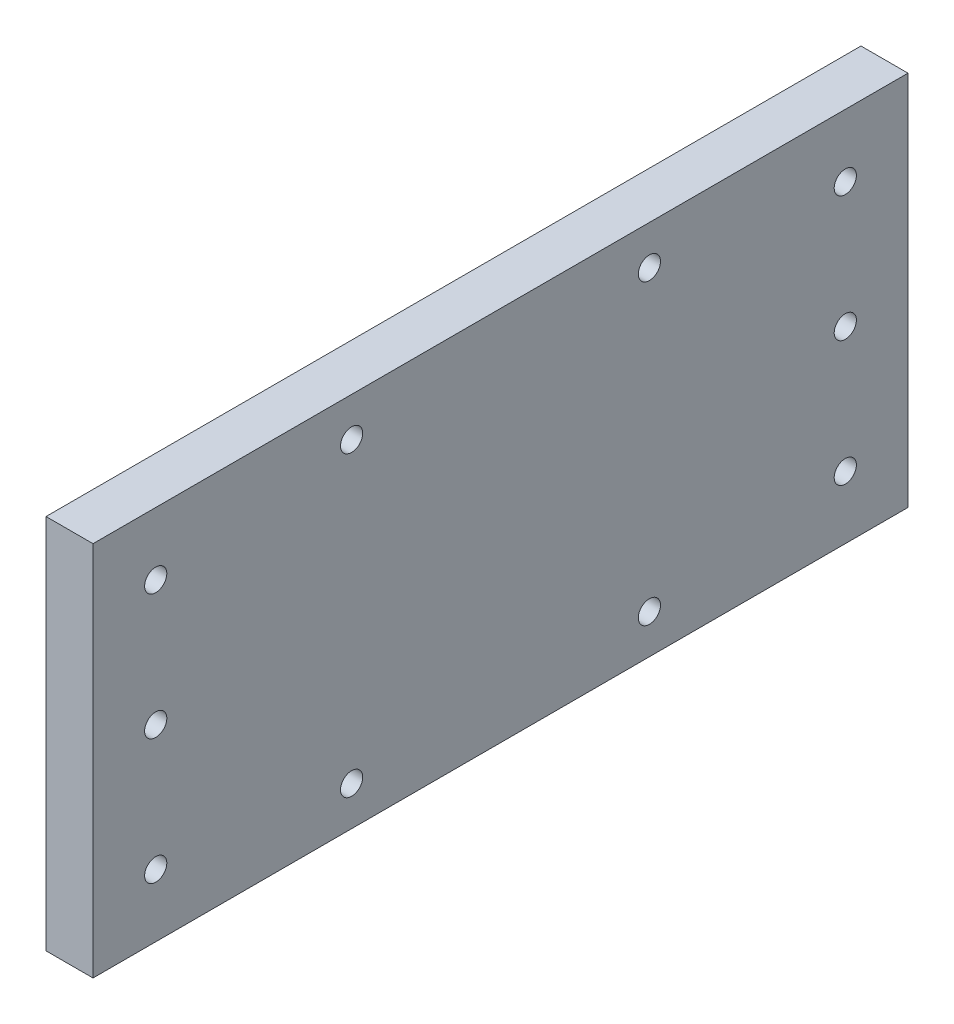
ISO-10303-21;
HEADER;
FILE_DESCRIPTION(('STEP AP214'),'2;1');
FILE_NAME('part.step','',(''),(''),'','','');
FILE_SCHEMA(('AUTOMOTIVE_DESIGN { 1 0 10303 214 1 1 1 1 }'));
ENDSEC;
DATA;
#1=APPLICATION_CONTEXT('core data for automotive mechanical design processes');
#2=APPLICATION_PROTOCOL_DEFINITION('international standard','automotive_design',2000,#1);
#3=PRODUCT_CONTEXT('',#1,'mechanical');
#4=PRODUCT('Part','Part','',(#3));
#5=PRODUCT_RELATED_PRODUCT_CATEGORY('part','',(#4));
#6=PRODUCT_DEFINITION_FORMATION('','',#4);
#7=PRODUCT_DEFINITION_CONTEXT('part definition',#1,'design');
#8=PRODUCT_DEFINITION('design','',#6,#7);
#9=PRODUCT_DEFINITION_SHAPE('','',#8);
#10=(LENGTH_UNIT() NAMED_UNIT(*) SI_UNIT(.MILLI.,.METRE.));
#11=(NAMED_UNIT(*) PLANE_ANGLE_UNIT() SI_UNIT($,.RADIAN.));
#12=(NAMED_UNIT(*) SI_UNIT($,.STERADIAN.) SOLID_ANGLE_UNIT());
#13=UNCERTAINTY_MEASURE_WITH_UNIT(LENGTH_MEASURE(1.E-05),#10,'distance_accuracy_value','');
#14=(GEOMETRIC_REPRESENTATION_CONTEXT(3) GLOBAL_UNCERTAINTY_ASSIGNED_CONTEXT((#13)) GLOBAL_UNIT_ASSIGNED_CONTEXT((#10,
#11,#12)) REPRESENTATION_CONTEXT('',''));
#15=CARTESIAN_POINT('',(0.,0.,0.));
#16=DIRECTION('',(0.,0.,1.));
#17=DIRECTION('',(1.,0.,0.));
#18=AXIS2_PLACEMENT_3D('',#15,#16,#17);
#19=CARTESIAN_POINT('',(4.76249999999999,38.1,165.1));
#20=DIRECTION('',(-1.,0.,0.));
#21=DIRECTION('',(0.,-1.,0.));
#22=AXIS2_PLACEMENT_3D('',#19,#20,#21);
#23=PLANE('',#22);
#24=CARTESIAN_POINT('',(4.7625,25.4,152.4));
#25=DIRECTION('',(1.,0.,0.));
#26=DIRECTION('',(0.,0.,-1.));
#27=AXIS2_PLACEMENT_3D('',#24,#25,#26);
#28=CIRCLE('',#27,2.24789999999999);
#29=CARTESIAN_POINT('',(4.7625,25.4,150.1521));
#30=VERTEX_POINT('',#29);
#31=EDGE_CURVE('E165',#30,#30,#28,.T.);
#32=ORIENTED_EDGE('',*,*,#31,.F.);
#33=EDGE_LOOP('',(#32));
#34=FACE_BOUND('',#33,.T.);
#35=CARTESIAN_POINT('',(4.7625,0.,152.4));
#36=DIRECTION('',(1.,0.,0.));
#37=DIRECTION('',(0.,0.,-1.));
#38=AXIS2_PLACEMENT_3D('',#35,#36,#37);
#39=CIRCLE('',#38,2.24789999999999);
#40=CARTESIAN_POINT('',(4.7625,0.,150.1521));
#41=VERTEX_POINT('',#40);
#42=EDGE_CURVE('E159',#41,#41,#39,.T.);
#43=ORIENTED_EDGE('',*,*,#42,.F.);
#44=EDGE_LOOP('',(#43));
#45=FACE_BOUND('',#44,.T.);
#46=CARTESIAN_POINT('',(4.7625,-25.4,152.4));
#47=DIRECTION('',(1.,0.,0.));
#48=DIRECTION('',(0.,0.,-1.));
#49=AXIS2_PLACEMENT_3D('',#46,#47,#48);
#50=CIRCLE('',#49,2.24789999999999);
#51=CARTESIAN_POINT('',(4.7625,-25.4,150.1521));
#52=VERTEX_POINT('',#51);
#53=EDGE_CURVE('E153',#52,#52,#50,.T.);
#54=ORIENTED_EDGE('',*,*,#53,.F.);
#55=EDGE_LOOP('',(#54));
#56=FACE_BOUND('',#55,.T.);
#57=CARTESIAN_POINT('',(4.7625,25.4,12.7));
#58=DIRECTION('',(1.,0.,0.));
#59=DIRECTION('',(0.,0.,-1.));
#60=AXIS2_PLACEMENT_3D('',#57,#58,#59);
#61=CIRCLE('',#60,2.24789999999999);
#62=CARTESIAN_POINT('',(4.7625,25.4,10.4521));
#63=VERTEX_POINT('',#62);
#64=EDGE_CURVE('E147',#63,#63,#61,.T.);
#65=ORIENTED_EDGE('',*,*,#64,.F.);
#66=EDGE_LOOP('',(#65));
#67=FACE_BOUND('',#66,.T.);
#68=CARTESIAN_POINT('',(4.7625,0.,12.7));
#69=DIRECTION('',(1.,0.,0.));
#70=DIRECTION('',(0.,0.,-1.));
#71=AXIS2_PLACEMENT_3D('',#68,#69,#70);
#72=CIRCLE('',#71,2.24789999999999);
#73=CARTESIAN_POINT('',(4.7625,0.,10.4521));
#74=VERTEX_POINT('',#73);
#75=EDGE_CURVE('E141',#74,#74,#72,.T.);
#76=ORIENTED_EDGE('',*,*,#75,.F.);
#77=EDGE_LOOP('',(#76));
#78=FACE_BOUND('',#77,.T.);
#79=CARTESIAN_POINT('',(4.7625,-25.4,12.7));
#80=DIRECTION('',(1.,0.,0.));
#81=DIRECTION('',(0.,0.,-1.));
#82=AXIS2_PLACEMENT_3D('',#79,#80,#81);
#83=CIRCLE('',#82,2.24789999999999);
#84=CARTESIAN_POINT('',(4.7625,-25.4,10.4521));
#85=VERTEX_POINT('',#84);
#86=EDGE_CURVE('E135',#85,#85,#83,.T.);
#87=ORIENTED_EDGE('',*,*,#86,.F.);
#88=EDGE_LOOP('',(#87));
#89=FACE_BOUND('',#88,.T.);
#90=CARTESIAN_POINT('',(4.7625,-30.1625,52.3875));
#91=DIRECTION('',(1.,0.,0.));
#92=DIRECTION('',(0.,0.,-1.));
#93=AXIS2_PLACEMENT_3D('',#90,#91,#92);
#94=CIRCLE('',#93,2.24789999999999);
#95=CARTESIAN_POINT('',(4.7625,-30.1625,50.1396));
#96=VERTEX_POINT('',#95);
#97=EDGE_CURVE('E129',#96,#96,#94,.T.);
#98=ORIENTED_EDGE('',*,*,#97,.F.);
#99=EDGE_LOOP('',(#98));
#100=FACE_BOUND('',#99,.T.);
#101=CARTESIAN_POINT('',(4.7625,30.1625,112.7125));
#102=DIRECTION('',(1.,0.,0.));
#103=DIRECTION('',(0.,0.,-1.));
#104=AXIS2_PLACEMENT_3D('',#101,#102,#103);
#105=CIRCLE('',#104,2.24789999999999);
#106=CARTESIAN_POINT('',(4.7625,30.1625,110.4646));
#107=VERTEX_POINT('',#106);
#108=EDGE_CURVE('E123',#107,#107,#105,.T.);
#109=ORIENTED_EDGE('',*,*,#108,.F.);
#110=EDGE_LOOP('',(#109));
#111=FACE_BOUND('',#110,.T.);
#112=CARTESIAN_POINT('',(4.7625,-30.1625,112.7125));
#113=DIRECTION('',(1.,0.,0.));
#114=DIRECTION('',(0.,0.,-1.));
#115=AXIS2_PLACEMENT_3D('',#112,#113,#114);
#116=CIRCLE('',#115,2.24789999999999);
#117=CARTESIAN_POINT('',(4.7625,-30.1625,110.4646));
#118=VERTEX_POINT('',#117);
#119=EDGE_CURVE('E117',#118,#118,#116,.T.);
#120=ORIENTED_EDGE('',*,*,#119,.F.);
#121=EDGE_LOOP('',(#120));
#122=FACE_BOUND('',#121,.T.);
#123=CARTESIAN_POINT('',(4.7625,30.1625,52.3875));
#124=DIRECTION('',(1.,0.,0.));
#125=DIRECTION('',(0.,0.,-1.));
#126=AXIS2_PLACEMENT_3D('',#123,#124,#125);
#127=CIRCLE('',#126,2.24789999999999);
#128=CARTESIAN_POINT('',(4.7625,30.1625,50.1396));
#129=VERTEX_POINT('',#128);
#130=EDGE_CURVE('E111',#129,#129,#127,.T.);
#131=ORIENTED_EDGE('',*,*,#130,.F.);
#132=EDGE_LOOP('',(#131));
#133=FACE_BOUND('',#132,.T.);
#134=DIRECTION('',(0.,1.,0.));
#135=VECTOR('',#134,1.);
#136=CARTESIAN_POINT('',(4.76249999999999,38.1,0.));
#137=LINE('',#136,#135);
#138=CARTESIAN_POINT('',(4.7625,-38.1,0.));
#139=VERTEX_POINT('',#138);
#140=CARTESIAN_POINT('',(4.76249999999999,38.1,0.));
#141=VERTEX_POINT('',#140);
#142=EDGE_CURVE('E95',#139,#141,#137,.T.);
#143=ORIENTED_EDGE('',*,*,#142,.T.);
#144=DIRECTION('',(0.,0.,-1.));
#145=VECTOR('',#144,1.);
#146=CARTESIAN_POINT('',(4.76249999999999,38.1,165.1));
#147=LINE('',#146,#145);
#148=CARTESIAN_POINT('',(4.76249999999999,38.1,165.1));
#149=VERTEX_POINT('',#148);
#150=EDGE_CURVE('E11',#149,#141,#147,.T.);
#151=ORIENTED_EDGE('',*,*,#150,.F.);
#152=DIRECTION('',(0.,1.,0.));
#153=VECTOR('',#152,1.);
#154=CARTESIAN_POINT('',(4.76249999999999,38.1,165.1));
#155=LINE('',#154,#153);
#156=CARTESIAN_POINT('',(4.7625,-38.1,165.1));
#157=VERTEX_POINT('',#156);
#158=EDGE_CURVE('E83',#157,#149,#155,.T.);
#159=ORIENTED_EDGE('',*,*,#158,.F.);
#160=DIRECTION('',(0.,0.,-1.));
#161=VECTOR('',#160,1.);
#162=CARTESIAN_POINT('',(4.7625,-38.1,165.1));
#163=LINE('',#162,#161);
#164=EDGE_CURVE('E91',#157,#139,#163,.T.);
#165=ORIENTED_EDGE('',*,*,#164,.T.);
#166=EDGE_LOOP('',(#143,#151,#159,#165));
#167=FACE_BOUND('',#166,.T.);
#168=ADVANCED_FACE('F32',(#34,#45,#56,#67,#78,#89,#100,#111,#122,#133,#167),#23,.F.);
#169=CARTESIAN_POINT('',(-4.76250000000001,38.1,165.1));
#170=DIRECTION('',(0.,-1.,0.));
#171=DIRECTION('',(0.,0.,-1.));
#172=AXIS2_PLACEMENT_3D('',#169,#170,#171);
#173=PLANE('',#172);
#174=DIRECTION('',(-1.,0.,0.));
#175=VECTOR('',#174,1.);
#176=CARTESIAN_POINT('',(-4.76250000000001,38.1,0.));
#177=LINE('',#176,#175);
#178=CARTESIAN_POINT('',(-4.76250000000001,38.1,0.));
#179=VERTEX_POINT('',#178);
#180=EDGE_CURVE('E87',#141,#179,#177,.T.);
#181=ORIENTED_EDGE('',*,*,#180,.T.);
#182=DIRECTION('',(0.,0.,-1.));
#183=VECTOR('',#182,1.);
#184=CARTESIAN_POINT('',(-4.76250000000001,38.1,165.1));
#185=LINE('',#184,#183);
#186=CARTESIAN_POINT('',(-4.76250000000001,38.1,165.1));
#187=VERTEX_POINT('',#186);
#188=EDGE_CURVE('E40',#187,#179,#185,.T.);
#189=ORIENTED_EDGE('',*,*,#188,.F.);
#190=DIRECTION('',(-1.,0.,0.));
#191=VECTOR('',#190,1.);
#192=CARTESIAN_POINT('',(-4.76250000000001,38.1,165.1));
#193=LINE('',#192,#191);
#194=EDGE_CURVE('E78',#149,#187,#193,.T.);
#195=ORIENTED_EDGE('',*,*,#194,.F.);
#196=ORIENTED_EDGE('',*,*,#150,.T.);
#197=EDGE_LOOP('',(#181,#189,#195,#196));
#198=FACE_BOUND('',#197,.T.);
#199=ADVANCED_FACE('F86',(#198),#173,.F.);
#200=CARTESIAN_POINT('',(-4.76250000000001,38.1,165.1));
#201=DIRECTION('',(1.,0.,0.));
#202=DIRECTION('',(0.,1.,0.));
#203=AXIS2_PLACEMENT_3D('',#200,#201,#202);
#204=PLANE('',#203);
#205=CARTESIAN_POINT('',(-4.76250000000002,25.4,152.4));
#206=DIRECTION('',(1.,0.,0.));
#207=DIRECTION('',(0.,0.,-1.));
#208=AXIS2_PLACEMENT_3D('',#205,#206,#207);
#209=CIRCLE('',#208,2.2479);
#210=CARTESIAN_POINT('',(-4.76250000000002,25.4,150.1521));
#211=VERTEX_POINT('',#210);
#212=EDGE_CURVE('E162',#211,#211,#209,.T.);
#213=ORIENTED_EDGE('',*,*,#212,.T.);
#214=EDGE_LOOP('',(#213));
#215=FACE_BOUND('',#214,.T.);
#216=CARTESIAN_POINT('',(-4.76250000000002,0.,152.4));
#217=DIRECTION('',(1.,0.,0.));
#218=DIRECTION('',(0.,0.,-1.));
#219=AXIS2_PLACEMENT_3D('',#216,#217,#218);
#220=CIRCLE('',#219,2.2479);
#221=CARTESIAN_POINT('',(-4.76250000000002,0.,150.1521));
#222=VERTEX_POINT('',#221);
#223=EDGE_CURVE('E156',#222,#222,#220,.T.);
#224=ORIENTED_EDGE('',*,*,#223,.T.);
#225=EDGE_LOOP('',(#224));
#226=FACE_BOUND('',#225,.T.);
#227=CARTESIAN_POINT('',(-4.76250000000002,-25.4,152.4));
#228=DIRECTION('',(1.,0.,0.));
#229=DIRECTION('',(0.,0.,-1.));
#230=AXIS2_PLACEMENT_3D('',#227,#228,#229);
#231=CIRCLE('',#230,2.2479);
#232=CARTESIAN_POINT('',(-4.76250000000002,-25.4,150.1521));
#233=VERTEX_POINT('',#232);
#234=EDGE_CURVE('E150',#233,#233,#231,.T.);
#235=ORIENTED_EDGE('',*,*,#234,.T.);
#236=EDGE_LOOP('',(#235));
#237=FACE_BOUND('',#236,.T.);
#238=CARTESIAN_POINT('',(-4.76250000000002,25.4,12.7));
#239=DIRECTION('',(1.,0.,0.));
#240=DIRECTION('',(0.,0.,-1.));
#241=AXIS2_PLACEMENT_3D('',#238,#239,#240);
#242=CIRCLE('',#241,2.2479);
#243=CARTESIAN_POINT('',(-4.76250000000002,25.4,10.4521));
#244=VERTEX_POINT('',#243);
#245=EDGE_CURVE('E144',#244,#244,#242,.T.);
#246=ORIENTED_EDGE('',*,*,#245,.T.);
#247=EDGE_LOOP('',(#246));
#248=FACE_BOUND('',#247,.T.);
#249=CARTESIAN_POINT('',(-4.76250000000002,0.,12.7));
#250=DIRECTION('',(1.,0.,0.));
#251=DIRECTION('',(0.,0.,-1.));
#252=AXIS2_PLACEMENT_3D('',#249,#250,#251);
#253=CIRCLE('',#252,2.2479);
#254=CARTESIAN_POINT('',(-4.76250000000002,0.,10.4521));
#255=VERTEX_POINT('',#254);
#256=EDGE_CURVE('E138',#255,#255,#253,.T.);
#257=ORIENTED_EDGE('',*,*,#256,.T.);
#258=EDGE_LOOP('',(#257));
#259=FACE_BOUND('',#258,.T.);
#260=CARTESIAN_POINT('',(-4.76250000000002,-25.4,12.7));
#261=DIRECTION('',(1.,0.,0.));
#262=DIRECTION('',(0.,0.,-1.));
#263=AXIS2_PLACEMENT_3D('',#260,#261,#262);
#264=CIRCLE('',#263,2.2479);
#265=CARTESIAN_POINT('',(-4.76250000000002,-25.4,10.4521));
#266=VERTEX_POINT('',#265);
#267=EDGE_CURVE('E132',#266,#266,#264,.T.);
#268=ORIENTED_EDGE('',*,*,#267,.T.);
#269=EDGE_LOOP('',(#268));
#270=FACE_BOUND('',#269,.T.);
#271=CARTESIAN_POINT('',(-4.76250000000001,-30.1625,52.3875));
#272=DIRECTION('',(1.,0.,0.));
#273=DIRECTION('',(0.,0.,-1.));
#274=AXIS2_PLACEMENT_3D('',#271,#272,#273);
#275=CIRCLE('',#274,2.2479);
#276=CARTESIAN_POINT('',(-4.76250000000001,-30.1625,50.1396));
#277=VERTEX_POINT('',#276);
#278=EDGE_CURVE('E126',#277,#277,#275,.T.);
#279=ORIENTED_EDGE('',*,*,#278,.T.);
#280=EDGE_LOOP('',(#279));
#281=FACE_BOUND('',#280,.T.);
#282=CARTESIAN_POINT('',(-4.76250000000002,30.1625,112.7125));
#283=DIRECTION('',(1.,0.,0.));
#284=DIRECTION('',(0.,0.,-1.));
#285=AXIS2_PLACEMENT_3D('',#282,#283,#284);
#286=CIRCLE('',#285,2.2479);
#287=CARTESIAN_POINT('',(-4.76250000000002,30.1625,110.4646));
#288=VERTEX_POINT('',#287);
#289=EDGE_CURVE('E120',#288,#288,#286,.T.);
#290=ORIENTED_EDGE('',*,*,#289,.T.);
#291=EDGE_LOOP('',(#290));
#292=FACE_BOUND('',#291,.T.);
#293=CARTESIAN_POINT('',(-4.76250000000001,-30.1625,112.7125));
#294=DIRECTION('',(1.,0.,0.));
#295=DIRECTION('',(0.,0.,-1.));
#296=AXIS2_PLACEMENT_3D('',#293,#294,#295);
#297=CIRCLE('',#296,2.2479);
#298=CARTESIAN_POINT('',(-4.76250000000001,-30.1625,110.4646));
#299=VERTEX_POINT('',#298);
#300=EDGE_CURVE('E114',#299,#299,#297,.T.);
#301=ORIENTED_EDGE('',*,*,#300,.T.);
#302=EDGE_LOOP('',(#301));
#303=FACE_BOUND('',#302,.T.);
#304=CARTESIAN_POINT('',(-4.76250000000002,30.1625,52.3875));
#305=DIRECTION('',(1.,0.,0.));
#306=DIRECTION('',(0.,0.,-1.));
#307=AXIS2_PLACEMENT_3D('',#304,#305,#306);
#308=CIRCLE('',#307,2.2479);
#309=CARTESIAN_POINT('',(-4.76250000000002,30.1625,50.1396));
#310=VERTEX_POINT('',#309);
#311=EDGE_CURVE('E98',#310,#310,#308,.T.);
#312=ORIENTED_EDGE('',*,*,#311,.T.);
#313=EDGE_LOOP('',(#312));
#314=FACE_BOUND('',#313,.T.);
#315=DIRECTION('',(0.,-1.,0.));
#316=VECTOR('',#315,1.);
#317=CARTESIAN_POINT('',(-4.76250000000001,38.1,0.));
#318=LINE('',#317,#316);
#319=CARTESIAN_POINT('',(-4.7625,-38.1,0.));
#320=VERTEX_POINT('',#319);
#321=EDGE_CURVE('E65',#179,#320,#318,.T.);
#322=ORIENTED_EDGE('',*,*,#321,.T.);
#323=DIRECTION('',(0.,0.,-1.));
#324=VECTOR('',#323,1.);
#325=CARTESIAN_POINT('',(-4.7625,-38.1,165.1));
#326=LINE('',#325,#324);
#327=CARTESIAN_POINT('',(-4.7625,-38.1,165.1));
#328=VERTEX_POINT('',#327);
#329=EDGE_CURVE('E88',#328,#320,#326,.T.);
#330=ORIENTED_EDGE('',*,*,#329,.F.);
#331=DIRECTION('',(0.,-1.,0.));
#332=VECTOR('',#331,1.);
#333=CARTESIAN_POINT('',(-4.76250000000001,38.1,165.1));
#334=LINE('',#333,#332);
#335=EDGE_CURVE('E81',#187,#328,#334,.T.);
#336=ORIENTED_EDGE('',*,*,#335,.F.);
#337=ORIENTED_EDGE('',*,*,#188,.T.);
#338=EDGE_LOOP('',(#322,#330,#336,#337));
#339=FACE_BOUND('',#338,.T.);
#340=ADVANCED_FACE('F89',(#215,#226,#237,#248,#259,#270,#281,#292,#303,#314,#339),#204,.F.);
#341=CARTESIAN_POINT('',(-4.7625,-38.1,165.1));
#342=DIRECTION('',(0.,1.,0.));
#343=DIRECTION('',(0.,0.,1.));
#344=AXIS2_PLACEMENT_3D('',#341,#342,#343);
#345=PLANE('',#344);
#346=DIRECTION('',(1.,0.,0.));
#347=VECTOR('',#346,1.);
#348=CARTESIAN_POINT('',(-4.7625,-38.1,0.));
#349=LINE('',#348,#347);
#350=EDGE_CURVE('E71',#320,#139,#349,.T.);
#351=ORIENTED_EDGE('',*,*,#350,.T.);
#352=ORIENTED_EDGE('',*,*,#164,.F.);
#353=DIRECTION('',(1.,0.,0.));
#354=VECTOR('',#353,1.);
#355=CARTESIAN_POINT('',(-4.7625,-38.1,165.1));
#356=LINE('',#355,#354);
#357=EDGE_CURVE('E48',#328,#157,#356,.T.);
#358=ORIENTED_EDGE('',*,*,#357,.F.);
#359=ORIENTED_EDGE('',*,*,#329,.T.);
#360=EDGE_LOOP('',(#351,#352,#358,#359));
#361=FACE_BOUND('',#360,.T.);
#362=ADVANCED_FACE('F103',(#361),#345,.F.);
#363=CARTESIAN_POINT('',(0.,0.,165.1));
#364=DIRECTION('',(0.,0.,1.));
#365=DIRECTION('',(1.,0.,0.));
#366=AXIS2_PLACEMENT_3D('',#363,#364,#365);
#367=PLANE('',#366);
#368=ORIENTED_EDGE('',*,*,#158,.T.);
#369=ORIENTED_EDGE('',*,*,#194,.T.);
#370=ORIENTED_EDGE('',*,*,#335,.T.);
#371=ORIENTED_EDGE('',*,*,#357,.T.);
#372=EDGE_LOOP('',(#368,#369,#370,#371));
#373=FACE_BOUND('',#372,.T.);
#374=ADVANCED_FACE('F79',(#373),#367,.T.);
#375=CARTESIAN_POINT('',(0.,0.,0.));
#376=DIRECTION('',(0.,0.,1.));
#377=DIRECTION('',(1.,0.,0.));
#378=AXIS2_PLACEMENT_3D('',#375,#376,#377);
#379=PLANE('',#378);
#380=ORIENTED_EDGE('',*,*,#142,.F.);
#381=ORIENTED_EDGE('',*,*,#350,.F.);
#382=ORIENTED_EDGE('',*,*,#321,.F.);
#383=ORIENTED_EDGE('',*,*,#180,.F.);
#384=EDGE_LOOP('',(#380,#381,#382,#383));
#385=FACE_BOUND('',#384,.T.);
#386=ADVANCED_FACE('F106',(#385),#379,.F.);
#387=CARTESIAN_POINT('',(4.7625,30.1625,52.3875));
#388=DIRECTION('',(1.,0.,0.));
#389=DIRECTION('',(0.,0.,-1.));
#390=AXIS2_PLACEMENT_3D('',#387,#388,#389);
#391=CYLINDRICAL_SURFACE('',#390,2.24789999999999);
#392=ORIENTED_EDGE('',*,*,#311,.F.);
#393=EDGE_LOOP('',(#392));
#394=FACE_BOUND('',#393,.T.);
#395=ORIENTED_EDGE('',*,*,#130,.T.);
#396=EDGE_LOOP('',(#395));
#397=FACE_BOUND('',#396,.T.);
#398=ADVANCED_FACE('F191',(#394,#397),#391,.F.);
#399=CARTESIAN_POINT('',(4.7625,-30.1625,112.7125));
#400=DIRECTION('',(1.,0.,0.));
#401=DIRECTION('',(0.,0.,-1.));
#402=AXIS2_PLACEMENT_3D('',#399,#400,#401);
#403=CYLINDRICAL_SURFACE('',#402,2.24789999999999);
#404=ORIENTED_EDGE('',*,*,#300,.F.);
#405=EDGE_LOOP('',(#404));
#406=FACE_BOUND('',#405,.T.);
#407=ORIENTED_EDGE('',*,*,#119,.T.);
#408=EDGE_LOOP('',(#407));
#409=FACE_BOUND('',#408,.T.);
#410=ADVANCED_FACE('F193',(#406,#409),#403,.F.);
#411=CARTESIAN_POINT('',(4.7625,30.1625,112.7125));
#412=DIRECTION('',(1.,0.,0.));
#413=DIRECTION('',(0.,0.,-1.));
#414=AXIS2_PLACEMENT_3D('',#411,#412,#413);
#415=CYLINDRICAL_SURFACE('',#414,2.24789999999999);
#416=ORIENTED_EDGE('',*,*,#289,.F.);
#417=EDGE_LOOP('',(#416));
#418=FACE_BOUND('',#417,.T.);
#419=ORIENTED_EDGE('',*,*,#108,.T.);
#420=EDGE_LOOP('',(#419));
#421=FACE_BOUND('',#420,.T.);
#422=ADVANCED_FACE('F200',(#418,#421),#415,.F.);
#423=CARTESIAN_POINT('',(4.7625,-30.1625,52.3875));
#424=DIRECTION('',(1.,0.,0.));
#425=DIRECTION('',(0.,0.,-1.));
#426=AXIS2_PLACEMENT_3D('',#423,#424,#425);
#427=CYLINDRICAL_SURFACE('',#426,2.24789999999999);
#428=ORIENTED_EDGE('',*,*,#278,.F.);
#429=EDGE_LOOP('',(#428));
#430=FACE_BOUND('',#429,.T.);
#431=ORIENTED_EDGE('',*,*,#97,.T.);
#432=EDGE_LOOP('',(#431));
#433=FACE_BOUND('',#432,.T.);
#434=ADVANCED_FACE('F254',(#430,#433),#427,.F.);
#435=CARTESIAN_POINT('',(4.7625,-25.4,12.7));
#436=DIRECTION('',(1.,0.,0.));
#437=DIRECTION('',(0.,0.,-1.));
#438=AXIS2_PLACEMENT_3D('',#435,#436,#437);
#439=CYLINDRICAL_SURFACE('',#438,2.24789999999999);
#440=ORIENTED_EDGE('',*,*,#267,.F.);
#441=EDGE_LOOP('',(#440));
#442=FACE_BOUND('',#441,.T.);
#443=ORIENTED_EDGE('',*,*,#86,.T.);
#444=EDGE_LOOP('',(#443));
#445=FACE_BOUND('',#444,.T.);
#446=ADVANCED_FACE('F262',(#442,#445),#439,.F.);
#447=CARTESIAN_POINT('',(4.7625,0.,12.7));
#448=DIRECTION('',(1.,0.,0.));
#449=DIRECTION('',(0.,0.,-1.));
#450=AXIS2_PLACEMENT_3D('',#447,#448,#449);
#451=CYLINDRICAL_SURFACE('',#450,2.24789999999999);
#452=ORIENTED_EDGE('',*,*,#256,.F.);
#453=EDGE_LOOP('',(#452));
#454=FACE_BOUND('',#453,.T.);
#455=ORIENTED_EDGE('',*,*,#75,.T.);
#456=EDGE_LOOP('',(#455));
#457=FACE_BOUND('',#456,.T.);
#458=ADVANCED_FACE('F284',(#454,#457),#451,.F.);
#459=CARTESIAN_POINT('',(4.7625,25.4,12.7));
#460=DIRECTION('',(1.,0.,0.));
#461=DIRECTION('',(0.,0.,-1.));
#462=AXIS2_PLACEMENT_3D('',#459,#460,#461);
#463=CYLINDRICAL_SURFACE('',#462,2.24789999999999);
#464=ORIENTED_EDGE('',*,*,#245,.F.);
#465=EDGE_LOOP('',(#464));
#466=FACE_BOUND('',#465,.T.);
#467=ORIENTED_EDGE('',*,*,#64,.T.);
#468=EDGE_LOOP('',(#467));
#469=FACE_BOUND('',#468,.T.);
#470=ADVANCED_FACE('F291',(#466,#469),#463,.F.);
#471=CARTESIAN_POINT('',(4.7625,-25.4,152.4));
#472=DIRECTION('',(1.,0.,0.));
#473=DIRECTION('',(0.,0.,-1.));
#474=AXIS2_PLACEMENT_3D('',#471,#472,#473);
#475=CYLINDRICAL_SURFACE('',#474,2.24789999999999);
#476=ORIENTED_EDGE('',*,*,#234,.F.);
#477=EDGE_LOOP('',(#476));
#478=FACE_BOUND('',#477,.T.);
#479=ORIENTED_EDGE('',*,*,#53,.T.);
#480=EDGE_LOOP('',(#479));
#481=FACE_BOUND('',#480,.T.);
#482=ADVANCED_FACE('F299',(#478,#481),#475,.F.);
#483=CARTESIAN_POINT('',(4.7625,0.,152.4));
#484=DIRECTION('',(1.,0.,0.));
#485=DIRECTION('',(0.,0.,-1.));
#486=AXIS2_PLACEMENT_3D('',#483,#484,#485);
#487=CYLINDRICAL_SURFACE('',#486,2.24789999999999);
#488=ORIENTED_EDGE('',*,*,#223,.F.);
#489=EDGE_LOOP('',(#488));
#490=FACE_BOUND('',#489,.T.);
#491=ORIENTED_EDGE('',*,*,#42,.T.);
#492=EDGE_LOOP('',(#491));
#493=FACE_BOUND('',#492,.T.);
#494=ADVANCED_FACE('F307',(#490,#493),#487,.F.);
#495=CARTESIAN_POINT('',(4.7625,25.4,152.4));
#496=DIRECTION('',(1.,0.,0.));
#497=DIRECTION('',(0.,0.,-1.));
#498=AXIS2_PLACEMENT_3D('',#495,#496,#497);
#499=CYLINDRICAL_SURFACE('',#498,2.24789999999999);
#500=ORIENTED_EDGE('',*,*,#212,.F.);
#501=EDGE_LOOP('',(#500));
#502=FACE_BOUND('',#501,.T.);
#503=ORIENTED_EDGE('',*,*,#31,.T.);
#504=EDGE_LOOP('',(#503));
#505=FACE_BOUND('',#504,.T.);
#506=ADVANCED_FACE('F169',(#502,#505),#499,.F.);
#507=CLOSED_SHELL('',(#168,#199,#340,#362,#374,#386,#398,#410,#422,#434,#446,#458,#470,#482,
#494,#506));
#508=MANIFOLD_SOLID_BREP('B2',#507);
#509=ADVANCED_BREP_SHAPE_REPRESENTATION('',(#18,#508),#14);
#510=SHAPE_DEFINITION_REPRESENTATION(#9,#509);
ENDSEC;
END-ISO-10303-21;
